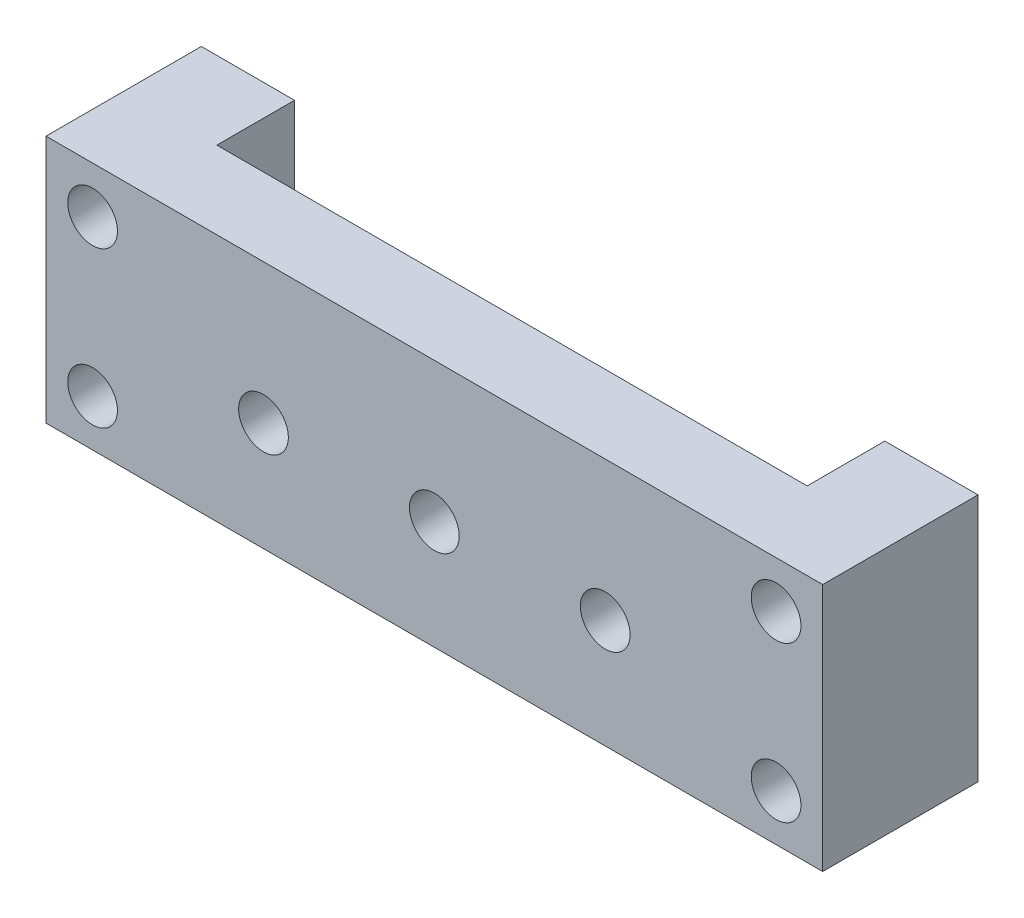
ISO-10303-21;
HEADER;
FILE_DESCRIPTION(('STEP AP214'),'2;1');
FILE_NAME('part.step','',(''),(''),'','','');
FILE_SCHEMA(('AUTOMOTIVE_DESIGN { 1 0 10303 214 1 1 1 1 }'));
ENDSEC;
DATA;
#1=APPLICATION_CONTEXT('core data for automotive mechanical design processes');
#2=APPLICATION_PROTOCOL_DEFINITION('international standard','automotive_design',2000,#1);
#3=PRODUCT_CONTEXT('',#1,'mechanical');
#4=PRODUCT('Part','Part','',(#3));
#5=PRODUCT_RELATED_PRODUCT_CATEGORY('part','',(#4));
#6=PRODUCT_DEFINITION_FORMATION('','',#4);
#7=PRODUCT_DEFINITION_CONTEXT('part definition',#1,'design');
#8=PRODUCT_DEFINITION('design','',#6,#7);
#9=PRODUCT_DEFINITION_SHAPE('','',#8);
#10=(LENGTH_UNIT() NAMED_UNIT(*) SI_UNIT(.MILLI.,.METRE.));
#11=(NAMED_UNIT(*) PLANE_ANGLE_UNIT() SI_UNIT($,.RADIAN.));
#12=(NAMED_UNIT(*) SI_UNIT($,.STERADIAN.) SOLID_ANGLE_UNIT());
#13=UNCERTAINTY_MEASURE_WITH_UNIT(LENGTH_MEASURE(1.E-05),#10,'distance_accuracy_value','');
#14=(GEOMETRIC_REPRESENTATION_CONTEXT(3) GLOBAL_UNCERTAINTY_ASSIGNED_CONTEXT((#13)) GLOBAL_UNIT_ASSIGNED_CONTEXT((#10,
#11,#12)) REPRESENTATION_CONTEXT('',''));
#15=CARTESIAN_POINT('',(0.,0.,0.));
#16=DIRECTION('',(0.,0.,1.));
#17=DIRECTION('',(1.,0.,0.));
#18=AXIS2_PLACEMENT_3D('',#15,#16,#17);
#19=CARTESIAN_POINT('',(0.,0.,0.));
#20=DIRECTION('',(0.,0.,1.));
#21=DIRECTION('',(1.,0.,0.));
#22=AXIS2_PLACEMENT_3D('',#19,#20,#21);
#23=PLANE('',#22);
#24=CARTESIAN_POINT('',(-11.,0.,0.));
#25=DIRECTION('',(0.,0.,1.));
#26=DIRECTION('',(1.,0.,0.));
#27=AXIS2_PLACEMENT_3D('',#24,#25,#26);
#28=CIRCLE('',#27,1.6);
#29=CARTESIAN_POINT('',(-9.4,0.,0.));
#30=VERTEX_POINT('',#29);
#31=EDGE_CURVE('E362',#30,#30,#28,.T.);
#32=ORIENTED_EDGE('',*,*,#31,.T.);
#33=EDGE_LOOP('',(#32));
#34=FACE_BOUND('',#33,.T.);
#35=CARTESIAN_POINT('',(11.,0.,0.));
#36=DIRECTION('',(0.,0.,1.));
#37=DIRECTION('',(1.,0.,0.));
#38=AXIS2_PLACEMENT_3D('',#35,#36,#37);
#39=CIRCLE('',#38,1.6);
#40=CARTESIAN_POINT('',(12.6,0.,0.));
#41=VERTEX_POINT('',#40);
#42=EDGE_CURVE('E363',#41,#41,#39,.T.);
#43=ORIENTED_EDGE('',*,*,#42,.T.);
#44=EDGE_LOOP('',(#43));
#45=FACE_BOUND('',#44,.T.);
#46=CARTESIAN_POINT('',(0.,0.,0.));
#47=DIRECTION('',(0.,0.,1.));
#48=DIRECTION('',(1.,0.,0.));
#49=AXIS2_PLACEMENT_3D('',#46,#47,#48);
#50=CIRCLE('',#49,3.);
#51=CARTESIAN_POINT('',(3.,0.,0.));
#52=VERTEX_POINT('',#51);
#53=EDGE_CURVE('E11',#52,#52,#50,.F.);
#54=ORIENTED_EDGE('',*,*,#53,.F.);
#55=EDGE_LOOP('',(#54));
#56=FACE_BOUND('',#55,.T.);
#57=DIRECTION('',(0.,1.,0.));
#58=VECTOR('',#57,1.);
#59=CARTESIAN_POINT('',(19.,9.,0.));
#60=LINE('',#59,#58);
#61=CARTESIAN_POINT('',(19.,-7.,0.));
#62=VERTEX_POINT('',#61);
#63=CARTESIAN_POINT('',(19.,9.,0.));
#64=VERTEX_POINT('',#63);
#65=EDGE_CURVE('E123',#62,#64,#60,.T.);
#66=ORIENTED_EDGE('',*,*,#65,.F.);
#67=DIRECTION('',(1.,0.,0.));
#68=VECTOR('',#67,1.);
#69=CARTESIAN_POINT('',(-25.,-7.,0.));
#70=LINE('',#69,#68);
#71=CARTESIAN_POINT('',(-19.,-7.,0.));
#72=VERTEX_POINT('',#71);
#73=EDGE_CURVE('E153',#72,#62,#70,.T.);
#74=ORIENTED_EDGE('',*,*,#73,.F.);
#75=DIRECTION('',(0.,-1.,0.));
#76=VECTOR('',#75,1.);
#77=CARTESIAN_POINT('',(-19.,9.,0.));
#78=LINE('',#77,#76);
#79=CARTESIAN_POINT('',(-19.,9.,0.));
#80=VERTEX_POINT('',#79);
#81=EDGE_CURVE('E134',#80,#72,#78,.T.);
#82=ORIENTED_EDGE('',*,*,#81,.F.);
#83=DIRECTION('',(-1.,0.,0.));
#84=VECTOR('',#83,1.);
#85=CARTESIAN_POINT('',(-25.,9.,0.));
#86=LINE('',#85,#84);
#87=EDGE_CURVE('E54',#64,#80,#86,.T.);
#88=ORIENTED_EDGE('',*,*,#87,.F.);
#89=EDGE_LOOP('',(#66,#74,#82,#88));
#90=FACE_BOUND('',#89,.T.);
#91=ADVANCED_FACE('F34',(#34,#45,#56,#90),#23,.F.);
#92=CARTESIAN_POINT('',(-25.,9.,5.));
#93=DIRECTION('',(1.,0.,0.));
#94=DIRECTION('',(0.,0.,-1.));
#95=AXIS2_PLACEMENT_3D('',#92,#93,#94);
#96=PLANE('',#95);
#97=DIRECTION('',(0.,0.,-1.));
#98=VECTOR('',#97,1.);
#99=CARTESIAN_POINT('',(-25.,9.,5.));
#100=LINE('',#99,#98);
#101=CARTESIAN_POINT('',(-25.,9.,5.));
#102=VERTEX_POINT('',#101);
#103=CARTESIAN_POINT('',(-25.,9.,-5.));
#104=VERTEX_POINT('',#103);
#105=EDGE_CURVE('E162',#102,#104,#100,.T.);
#106=ORIENTED_EDGE('',*,*,#105,.T.);
#107=DIRECTION('',(0.,1.,0.));
#108=VECTOR('',#107,1.);
#109=CARTESIAN_POINT('',(-25.,9.,-5.));
#110=LINE('',#109,#108);
#111=CARTESIAN_POINT('',(-25.,-7.,-5.));
#112=VERTEX_POINT('',#111);
#113=EDGE_CURVE('E135',#112,#104,#110,.T.);
#114=ORIENTED_EDGE('',*,*,#113,.F.);
#115=DIRECTION('',(0.,0.,-1.));
#116=VECTOR('',#115,1.);
#117=CARTESIAN_POINT('',(-25.,-7.,5.));
#118=LINE('',#117,#116);
#119=CARTESIAN_POINT('',(-25.,-7.,5.));
#120=VERTEX_POINT('',#119);
#121=EDGE_CURVE('E42',#120,#112,#118,.T.);
#122=ORIENTED_EDGE('',*,*,#121,.F.);
#123=DIRECTION('',(0.,-1.,0.));
#124=VECTOR('',#123,1.);
#125=CARTESIAN_POINT('',(-25.,9.,5.));
#126=LINE('',#125,#124);
#127=EDGE_CURVE('E154',#102,#120,#126,.T.);
#128=ORIENTED_EDGE('',*,*,#127,.F.);
#129=EDGE_LOOP('',(#106,#114,#122,#128));
#130=FACE_BOUND('',#129,.T.);
#131=ADVANCED_FACE('F36',(#130),#96,.F.);
#132=CARTESIAN_POINT('',(-25.,-7.,5.));
#133=DIRECTION('',(0.,1.,0.));
#134=DIRECTION('',(0.,0.,1.));
#135=AXIS2_PLACEMENT_3D('',#132,#133,#134);
#136=PLANE('',#135);
#137=ORIENTED_EDGE('',*,*,#121,.T.);
#138=DIRECTION('',(-1.,0.,0.));
#139=VECTOR('',#138,1.);
#140=CARTESIAN_POINT('',(-25.,-7.,-5.));
#141=LINE('',#140,#139);
#142=CARTESIAN_POINT('',(-19.,-7.,-5.));
#143=VERTEX_POINT('',#142);
#144=EDGE_CURVE('E142',#143,#112,#141,.T.);
#145=ORIENTED_EDGE('',*,*,#144,.F.);
#146=DIRECTION('',(0.,0.,1.));
#147=VECTOR('',#146,1.);
#148=CARTESIAN_POINT('',(-19.,-7.,-5.));
#149=LINE('',#148,#147);
#150=EDGE_CURVE('E145',#143,#72,#149,.T.);
#151=ORIENTED_EDGE('',*,*,#150,.T.);
#152=ORIENTED_EDGE('',*,*,#73,.T.);
#153=DIRECTION('',(0.,0.,1.));
#154=VECTOR('',#153,1.);
#155=CARTESIAN_POINT('',(19.,-7.,-5.));
#156=LINE('',#155,#154);
#157=CARTESIAN_POINT('',(19.,-7.,-5.));
#158=VERTEX_POINT('',#157);
#159=EDGE_CURVE('E115',#158,#62,#156,.T.);
#160=ORIENTED_EDGE('',*,*,#159,.F.);
#161=DIRECTION('',(-1.,0.,0.));
#162=VECTOR('',#161,1.);
#163=CARTESIAN_POINT('',(25.,-7.,-5.));
#164=LINE('',#163,#162);
#165=CARTESIAN_POINT('',(25.,-7.,-5.));
#166=VERTEX_POINT('',#165);
#167=EDGE_CURVE('E112',#166,#158,#164,.T.);
#168=ORIENTED_EDGE('',*,*,#167,.F.);
#169=DIRECTION('',(0.,0.,-1.));
#170=VECTOR('',#169,1.);
#171=CARTESIAN_POINT('',(25.,-7.,5.));
#172=LINE('',#171,#170);
#173=CARTESIAN_POINT('',(25.,-7.,5.));
#174=VERTEX_POINT('',#173);
#175=EDGE_CURVE('E101',#174,#166,#172,.T.);
#176=ORIENTED_EDGE('',*,*,#175,.F.);
#177=DIRECTION('',(1.,0.,0.));
#178=VECTOR('',#177,1.);
#179=CARTESIAN_POINT('',(-25.,-7.,5.));
#180=LINE('',#179,#178);
#181=EDGE_CURVE('E157',#120,#174,#180,.T.);
#182=ORIENTED_EDGE('',*,*,#181,.F.);
#183=EDGE_LOOP('',(#137,#145,#151,#152,#160,#168,#176,#182));
#184=FACE_BOUND('',#183,.T.);
#185=ADVANCED_FACE('F113',(#184),#136,.F.);
#186=CARTESIAN_POINT('',(25.,9.,5.));
#187=DIRECTION('',(-1.,0.,0.));
#188=DIRECTION('',(0.,-1.,0.));
#189=AXIS2_PLACEMENT_3D('',#186,#187,#188);
#190=PLANE('',#189);
#191=ORIENTED_EDGE('',*,*,#175,.T.);
#192=DIRECTION('',(0.,-1.,0.));
#193=VECTOR('',#192,1.);
#194=CARTESIAN_POINT('',(25.,9.,-5.));
#195=LINE('',#194,#193);
#196=CARTESIAN_POINT('',(25.,9.,-5.));
#197=VERTEX_POINT('',#196);
#198=EDGE_CURVE('E106',#197,#166,#195,.T.);
#199=ORIENTED_EDGE('',*,*,#198,.F.);
#200=DIRECTION('',(0.,0.,-1.));
#201=VECTOR('',#200,1.);
#202=CARTESIAN_POINT('',(25.,9.,5.));
#203=LINE('',#202,#201);
#204=CARTESIAN_POINT('',(25.,9.,5.));
#205=VERTEX_POINT('',#204);
#206=EDGE_CURVE('E109',#205,#197,#203,.T.);
#207=ORIENTED_EDGE('',*,*,#206,.F.);
#208=DIRECTION('',(0.,1.,0.));
#209=VECTOR('',#208,1.);
#210=CARTESIAN_POINT('',(25.,9.,5.));
#211=LINE('',#210,#209);
#212=EDGE_CURVE('E107',#174,#205,#211,.T.);
#213=ORIENTED_EDGE('',*,*,#212,.F.);
#214=EDGE_LOOP('',(#191,#199,#207,#213));
#215=FACE_BOUND('',#214,.T.);
#216=ADVANCED_FACE('F103',(#215),#190,.F.);
#217=CARTESIAN_POINT('',(-25.,9.,5.));
#218=DIRECTION('',(0.,-1.,0.));
#219=DIRECTION('',(1.,0.,0.));
#220=AXIS2_PLACEMENT_3D('',#217,#218,#219);
#221=PLANE('',#220);
#222=ORIENTED_EDGE('',*,*,#206,.T.);
#223=DIRECTION('',(1.,0.,0.));
#224=VECTOR('',#223,1.);
#225=CARTESIAN_POINT('',(25.,9.,-5.));
#226=LINE('',#225,#224);
#227=CARTESIAN_POINT('',(19.,9.,-5.));
#228=VERTEX_POINT('',#227);
#229=EDGE_CURVE('E122',#228,#197,#226,.T.);
#230=ORIENTED_EDGE('',*,*,#229,.F.);
#231=DIRECTION('',(0.,0.,1.));
#232=VECTOR('',#231,1.);
#233=CARTESIAN_POINT('',(19.,9.,-5.));
#234=LINE('',#233,#232);
#235=EDGE_CURVE('E49',#228,#64,#234,.T.);
#236=ORIENTED_EDGE('',*,*,#235,.T.);
#237=ORIENTED_EDGE('',*,*,#87,.T.);
#238=DIRECTION('',(0.,0.,1.));
#239=VECTOR('',#238,1.);
#240=CARTESIAN_POINT('',(-19.,9.,-5.));
#241=LINE('',#240,#239);
#242=CARTESIAN_POINT('',(-19.,9.,-5.));
#243=VERTEX_POINT('',#242);
#244=EDGE_CURVE('E150',#243,#80,#241,.T.);
#245=ORIENTED_EDGE('',*,*,#244,.F.);
#246=DIRECTION('',(1.,0.,0.));
#247=VECTOR('',#246,1.);
#248=CARTESIAN_POINT('',(-25.,9.,-5.));
#249=LINE('',#248,#247);
#250=EDGE_CURVE('E138',#104,#243,#249,.T.);
#251=ORIENTED_EDGE('',*,*,#250,.F.);
#252=ORIENTED_EDGE('',*,*,#105,.F.);
#253=DIRECTION('',(-1.,0.,0.));
#254=VECTOR('',#253,1.);
#255=CARTESIAN_POINT('',(-25.,9.,5.));
#256=LINE('',#255,#254);
#257=EDGE_CURVE('E160',#205,#102,#256,.T.);
#258=ORIENTED_EDGE('',*,*,#257,.F.);
#259=EDGE_LOOP('',(#222,#230,#236,#237,#245,#251,#252,#258));
#260=FACE_BOUND('',#259,.T.);
#261=ADVANCED_FACE('F178',(#260),#221,.F.);
#262=CARTESIAN_POINT('',(0.,0.,5.));
#263=DIRECTION('',(0.,0.,1.));
#264=DIRECTION('',(1.,0.,0.));
#265=AXIS2_PLACEMENT_3D('',#262,#263,#264);
#266=PLANE('',#265);
#267=CARTESIAN_POINT('',(-11.,0.,5.));
#268=DIRECTION('',(0.,0.,-1.));
#269=DIRECTION('',(-1.,0.,0.));
#270=AXIS2_PLACEMENT_3D('',#267,#268,#269);
#271=CIRCLE('',#270,1.6);
#272=CARTESIAN_POINT('',(-12.6,0.,5.));
#273=VERTEX_POINT('',#272);
#274=EDGE_CURVE('E360',#273,#273,#271,.T.);
#275=ORIENTED_EDGE('',*,*,#274,.T.);
#276=EDGE_LOOP('',(#275));
#277=FACE_BOUND('',#276,.T.);
#278=CARTESIAN_POINT('',(-22.,-4.,5.));
#279=DIRECTION('',(0.,0.,-1.));
#280=DIRECTION('',(-1.,0.,0.));
#281=AXIS2_PLACEMENT_3D('',#278,#279,#280);
#282=CIRCLE('',#281,1.6);
#283=CARTESIAN_POINT('',(-23.6,-4.,5.));
#284=VERTEX_POINT('',#283);
#285=EDGE_CURVE('E388',#284,#284,#282,.T.);
#286=ORIENTED_EDGE('',*,*,#285,.T.);
#287=EDGE_LOOP('',(#286));
#288=FACE_BOUND('',#287,.T.);
#289=CARTESIAN_POINT('',(-22.,6.,5.));
#290=DIRECTION('',(0.,0.,-1.));
#291=DIRECTION('',(-1.,0.,0.));
#292=AXIS2_PLACEMENT_3D('',#289,#290,#291);
#293=CIRCLE('',#292,1.6);
#294=CARTESIAN_POINT('',(-23.6,6.,5.));
#295=VERTEX_POINT('',#294);
#296=EDGE_CURVE('E382',#295,#295,#293,.T.);
#297=ORIENTED_EDGE('',*,*,#296,.T.);
#298=EDGE_LOOP('',(#297));
#299=FACE_BOUND('',#298,.T.);
#300=CARTESIAN_POINT('',(22.,6.,5.));
#301=DIRECTION('',(0.,0.,-1.));
#302=DIRECTION('',(1.,0.,0.));
#303=AXIS2_PLACEMENT_3D('',#300,#301,#302);
#304=CIRCLE('',#303,1.6);
#305=CARTESIAN_POINT('',(23.6,6.,5.));
#306=VERTEX_POINT('',#305);
#307=EDGE_CURVE('E374',#306,#306,#304,.T.);
#308=ORIENTED_EDGE('',*,*,#307,.T.);
#309=EDGE_LOOP('',(#308));
#310=FACE_BOUND('',#309,.T.);
#311=CARTESIAN_POINT('',(22.,-4.,5.));
#312=DIRECTION('',(0.,0.,-1.));
#313=DIRECTION('',(1.,0.,0.));
#314=AXIS2_PLACEMENT_3D('',#311,#312,#313);
#315=CIRCLE('',#314,1.6);
#316=CARTESIAN_POINT('',(23.6,-4.,5.));
#317=VERTEX_POINT('',#316);
#318=EDGE_CURVE('E381',#317,#317,#315,.T.);
#319=ORIENTED_EDGE('',*,*,#318,.T.);
#320=EDGE_LOOP('',(#319));
#321=FACE_BOUND('',#320,.T.);
#322=CARTESIAN_POINT('',(11.,0.,5.));
#323=DIRECTION('',(0.,0.,-1.));
#324=DIRECTION('',(1.,0.,0.));
#325=AXIS2_PLACEMENT_3D('',#322,#323,#324);
#326=CIRCLE('',#325,1.6);
#327=CARTESIAN_POINT('',(12.6,0.,5.));
#328=VERTEX_POINT('',#327);
#329=EDGE_CURVE('E394',#328,#328,#326,.T.);
#330=ORIENTED_EDGE('',*,*,#329,.T.);
#331=EDGE_LOOP('',(#330));
#332=FACE_BOUND('',#331,.T.);
#333=CARTESIAN_POINT('',(0.,0.,5.));
#334=DIRECTION('',(0.,0.,-1.));
#335=DIRECTION('',(-1.,0.,0.));
#336=AXIS2_PLACEMENT_3D('',#333,#334,#335);
#337=CIRCLE('',#336,1.6);
#338=CARTESIAN_POINT('',(-1.6,0.,5.));
#339=VERTEX_POINT('',#338);
#340=EDGE_CURVE('E366',#339,#339,#337,.T.);
#341=ORIENTED_EDGE('',*,*,#340,.T.);
#342=EDGE_LOOP('',(#341));
#343=FACE_BOUND('',#342,.T.);
#344=ORIENTED_EDGE('',*,*,#127,.T.);
#345=ORIENTED_EDGE('',*,*,#181,.T.);
#346=ORIENTED_EDGE('',*,*,#212,.T.);
#347=ORIENTED_EDGE('',*,*,#257,.T.);
#348=EDGE_LOOP('',(#344,#345,#346,#347));
#349=FACE_BOUND('',#348,.T.);
#350=ADVANCED_FACE('F186',(#277,#288,#299,#310,#321,#332,#343,#349),#266,.T.);
#351=CARTESIAN_POINT('',(-19.,9.,-5.));
#352=DIRECTION('',(-1.,0.,0.));
#353=DIRECTION('',(0.,0.,1.));
#354=AXIS2_PLACEMENT_3D('',#351,#352,#353);
#355=PLANE('',#354);
#356=ORIENTED_EDGE('',*,*,#81,.T.);
#357=ORIENTED_EDGE('',*,*,#150,.F.);
#358=DIRECTION('',(0.,-1.,0.));
#359=VECTOR('',#358,1.);
#360=CARTESIAN_POINT('',(-19.,9.,-5.));
#361=LINE('',#360,#359);
#362=EDGE_CURVE('E140',#243,#143,#361,.T.);
#363=ORIENTED_EDGE('',*,*,#362,.F.);
#364=ORIENTED_EDGE('',*,*,#244,.T.);
#365=EDGE_LOOP('',(#356,#357,#363,#364));
#366=FACE_BOUND('',#365,.T.);
#367=ADVANCED_FACE('F180',(#366),#355,.F.);
#368=CARTESIAN_POINT('',(0.,0.,-5.));
#369=DIRECTION('',(0.,0.,1.));
#370=DIRECTION('',(1.,0.,0.));
#371=AXIS2_PLACEMENT_3D('',#368,#369,#370);
#372=PLANE('',#371);
#373=CARTESIAN_POINT('',(-22.,-4.,-5.));
#374=DIRECTION('',(0.,0.,-1.));
#375=DIRECTION('',(-1.,0.,0.));
#376=AXIS2_PLACEMENT_3D('',#373,#374,#375);
#377=CIRCLE('',#376,1.6);
#378=CARTESIAN_POINT('',(-23.6,-4.,-5.));
#379=VERTEX_POINT('',#378);
#380=EDGE_CURVE('E385',#379,#379,#377,.T.);
#381=ORIENTED_EDGE('',*,*,#380,.F.);
#382=EDGE_LOOP('',(#381));
#383=FACE_BOUND('',#382,.T.);
#384=CARTESIAN_POINT('',(-22.,6.,-5.));
#385=DIRECTION('',(0.,0.,-1.));
#386=DIRECTION('',(-1.,0.,0.));
#387=AXIS2_PLACEMENT_3D('',#384,#385,#386);
#388=CIRCLE('',#387,1.6);
#389=CARTESIAN_POINT('',(-23.6,6.,-5.));
#390=VERTEX_POINT('',#389);
#391=EDGE_CURVE('E377',#390,#390,#388,.T.);
#392=ORIENTED_EDGE('',*,*,#391,.F.);
#393=EDGE_LOOP('',(#392));
#394=FACE_BOUND('',#393,.T.);
#395=ORIENTED_EDGE('',*,*,#113,.T.);
#396=ORIENTED_EDGE('',*,*,#250,.T.);
#397=ORIENTED_EDGE('',*,*,#362,.T.);
#398=ORIENTED_EDGE('',*,*,#144,.T.);
#399=EDGE_LOOP('',(#395,#396,#397,#398));
#400=FACE_BOUND('',#399,.T.);
#401=ADVANCED_FACE('F172',(#383,#394,#400),#372,.F.);
#402=CARTESIAN_POINT('',(19.,9.,-5.));
#403=DIRECTION('',(1.,0.,0.));
#404=DIRECTION('',(0.,0.,-1.));
#405=AXIS2_PLACEMENT_3D('',#402,#403,#404);
#406=PLANE('',#405);
#407=ORIENTED_EDGE('',*,*,#65,.T.);
#408=ORIENTED_EDGE('',*,*,#235,.F.);
#409=DIRECTION('',(0.,1.,0.));
#410=VECTOR('',#409,1.);
#411=CARTESIAN_POINT('',(19.,9.,-5.));
#412=LINE('',#411,#410);
#413=EDGE_CURVE('E118',#158,#228,#412,.T.);
#414=ORIENTED_EDGE('',*,*,#413,.F.);
#415=ORIENTED_EDGE('',*,*,#159,.T.);
#416=EDGE_LOOP('',(#407,#408,#414,#415));
#417=FACE_BOUND('',#416,.T.);
#418=ADVANCED_FACE('F184',(#417),#406,.F.);
#419=CARTESIAN_POINT('',(0.,0.,-5.));
#420=DIRECTION('',(0.,0.,-1.));
#421=DIRECTION('',(-1.,0.,0.));
#422=AXIS2_PLACEMENT_3D('',#419,#420,#421);
#423=PLANE('',#422);
#424=CARTESIAN_POINT('',(22.,6.,-5.));
#425=DIRECTION('',(0.,0.,-1.));
#426=DIRECTION('',(1.,0.,0.));
#427=AXIS2_PLACEMENT_3D('',#424,#425,#426);
#428=CIRCLE('',#427,1.6);
#429=CARTESIAN_POINT('',(23.6,6.,-5.));
#430=VERTEX_POINT('',#429);
#431=EDGE_CURVE('E378',#430,#430,#428,.T.);
#432=ORIENTED_EDGE('',*,*,#431,.F.);
#433=EDGE_LOOP('',(#432));
#434=FACE_BOUND('',#433,.T.);
#435=CARTESIAN_POINT('',(22.,-4.,-5.));
#436=DIRECTION('',(0.,0.,-1.));
#437=DIRECTION('',(1.,0.,0.));
#438=AXIS2_PLACEMENT_3D('',#435,#436,#437);
#439=CIRCLE('',#438,1.6);
#440=CARTESIAN_POINT('',(23.6,-4.,-5.));
#441=VERTEX_POINT('',#440);
#442=EDGE_CURVE('E397',#441,#441,#439,.T.);
#443=ORIENTED_EDGE('',*,*,#442,.F.);
#444=EDGE_LOOP('',(#443));
#445=FACE_BOUND('',#444,.T.);
#446=ORIENTED_EDGE('',*,*,#198,.T.);
#447=ORIENTED_EDGE('',*,*,#167,.T.);
#448=ORIENTED_EDGE('',*,*,#413,.T.);
#449=ORIENTED_EDGE('',*,*,#229,.T.);
#450=EDGE_LOOP('',(#446,#447,#448,#449));
#451=FACE_BOUND('',#450,.T.);
#452=ADVANCED_FACE('F121',(#434,#445,#451),#423,.T.);
#453=CARTESIAN_POINT('',(0.,0.,-5.));
#454=DIRECTION('',(0.,0.,1.));
#455=DIRECTION('',(1.,0.,0.));
#456=AXIS2_PLACEMENT_3D('',#453,#454,#455);
#457=CYLINDRICAL_SURFACE('',#456,3.);
#458=CARTESIAN_POINT('',(0.,0.,-5.));
#459=DIRECTION('',(0.,0.,-1.));
#460=DIRECTION('',(-1.,0.,0.));
#461=AXIS2_PLACEMENT_3D('',#458,#459,#460);
#462=CIRCLE('',#461,3.);
#463=CARTESIAN_POINT('',(-3.,0.,-5.));
#464=VERTEX_POINT('',#463);
#465=EDGE_CURVE('E125',#464,#464,#462,.T.);
#466=ORIENTED_EDGE('',*,*,#465,.F.);
#467=EDGE_LOOP('',(#466));
#468=FACE_BOUND('',#467,.T.);
#469=ORIENTED_EDGE('',*,*,#53,.T.);
#470=EDGE_LOOP('',(#469));
#471=FACE_BOUND('',#470,.T.);
#472=ADVANCED_FACE('F245',(#468,#471),#457,.T.);
#473=CARTESIAN_POINT('',(0.,0.,-5.));
#474=DIRECTION('',(0.,0.,-1.));
#475=DIRECTION('',(-1.,0.,0.));
#476=AXIS2_PLACEMENT_3D('',#473,#474,#475);
#477=PLANE('',#476);
#478=CARTESIAN_POINT('',(0.,0.,-5.));
#479=DIRECTION('',(0.,0.,-1.));
#480=DIRECTION('',(-1.,0.,0.));
#481=AXIS2_PLACEMENT_3D('',#478,#479,#480);
#482=CIRCLE('',#481,1.6);
#483=CARTESIAN_POINT('',(-1.6,0.,-5.));
#484=VERTEX_POINT('',#483);
#485=EDGE_CURVE('E371',#484,#484,#482,.T.);
#486=ORIENTED_EDGE('',*,*,#485,.F.);
#487=EDGE_LOOP('',(#486));
#488=FACE_BOUND('',#487,.T.);
#489=ORIENTED_EDGE('',*,*,#465,.T.);
#490=EDGE_LOOP('',(#489));
#491=FACE_BOUND('',#490,.T.);
#492=ADVANCED_FACE('F249',(#488,#491),#477,.T.);
#493=CARTESIAN_POINT('',(0.,0.,5.));
#494=DIRECTION('',(0.,0.,-1.));
#495=DIRECTION('',(-1.,0.,0.));
#496=AXIS2_PLACEMENT_3D('',#493,#494,#495);
#497=CYLINDRICAL_SURFACE('',#496,1.6);
#498=ORIENTED_EDGE('',*,*,#340,.F.);
#499=EDGE_LOOP('',(#498));
#500=FACE_BOUND('',#499,.T.);
#501=ORIENTED_EDGE('',*,*,#485,.T.);
#502=EDGE_LOOP('',(#501));
#503=FACE_BOUND('',#502,.T.);
#504=ADVANCED_FACE('F284',(#500,#503),#497,.F.);
#505=CARTESIAN_POINT('',(22.,-4.,5.));
#506=DIRECTION('',(0.,0.,-1.));
#507=DIRECTION('',(-1.,0.,0.));
#508=AXIS2_PLACEMENT_3D('',#505,#506,#507);
#509=CYLINDRICAL_SURFACE('',#508,1.6);
#510=ORIENTED_EDGE('',*,*,#318,.F.);
#511=EDGE_LOOP('',(#510));
#512=FACE_BOUND('',#511,.T.);
#513=ORIENTED_EDGE('',*,*,#442,.T.);
#514=EDGE_LOOP('',(#513));
#515=FACE_BOUND('',#514,.T.);
#516=ADVANCED_FACE('F294',(#512,#515),#509,.F.);
#517=CARTESIAN_POINT('',(22.,6.,5.));
#518=DIRECTION('',(0.,0.,-1.));
#519=DIRECTION('',(-1.,0.,0.));
#520=AXIS2_PLACEMENT_3D('',#517,#518,#519);
#521=CYLINDRICAL_SURFACE('',#520,1.6);
#522=ORIENTED_EDGE('',*,*,#307,.F.);
#523=EDGE_LOOP('',(#522));
#524=FACE_BOUND('',#523,.T.);
#525=ORIENTED_EDGE('',*,*,#431,.T.);
#526=EDGE_LOOP('',(#525));
#527=FACE_BOUND('',#526,.T.);
#528=ADVANCED_FACE('F304',(#524,#527),#521,.F.);
#529=CARTESIAN_POINT('',(-22.,6.,5.));
#530=DIRECTION('',(0.,0.,-1.));
#531=DIRECTION('',(-1.,0.,0.));
#532=AXIS2_PLACEMENT_3D('',#529,#530,#531);
#533=CYLINDRICAL_SURFACE('',#532,1.6);
#534=ORIENTED_EDGE('',*,*,#296,.F.);
#535=EDGE_LOOP('',(#534));
#536=FACE_BOUND('',#535,.T.);
#537=ORIENTED_EDGE('',*,*,#391,.T.);
#538=EDGE_LOOP('',(#537));
#539=FACE_BOUND('',#538,.T.);
#540=ADVANCED_FACE('F314',(#536,#539),#533,.F.);
#541=CARTESIAN_POINT('',(-22.,-4.,5.));
#542=DIRECTION('',(0.,0.,-1.));
#543=DIRECTION('',(-1.,0.,0.));
#544=AXIS2_PLACEMENT_3D('',#541,#542,#543);
#545=CYLINDRICAL_SURFACE('',#544,1.6);
#546=ORIENTED_EDGE('',*,*,#285,.F.);
#547=EDGE_LOOP('',(#546));
#548=FACE_BOUND('',#547,.T.);
#549=ORIENTED_EDGE('',*,*,#380,.T.);
#550=EDGE_LOOP('',(#549));
#551=FACE_BOUND('',#550,.T.);
#552=ADVANCED_FACE('F324',(#548,#551),#545,.F.);
#553=CARTESIAN_POINT('',(11.,0.,5.));
#554=DIRECTION('',(0.,0.,-1.));
#555=DIRECTION('',(-1.,0.,0.));
#556=AXIS2_PLACEMENT_3D('',#553,#554,#555);
#557=CYLINDRICAL_SURFACE('',#556,1.6);
#558=ORIENTED_EDGE('',*,*,#329,.F.);
#559=EDGE_LOOP('',(#558));
#560=FACE_BOUND('',#559,.T.);
#561=ORIENTED_EDGE('',*,*,#42,.F.);
#562=EDGE_LOOP('',(#561));
#563=FACE_BOUND('',#562,.T.);
#564=ADVANCED_FACE('F334',(#560,#563),#557,.F.);
#565=CARTESIAN_POINT('',(-11.,0.,5.));
#566=DIRECTION('',(0.,0.,-1.));
#567=DIRECTION('',(-1.,0.,0.));
#568=AXIS2_PLACEMENT_3D('',#565,#566,#567);
#569=CYLINDRICAL_SURFACE('',#568,1.6);
#570=ORIENTED_EDGE('',*,*,#274,.F.);
#571=EDGE_LOOP('',(#570));
#572=FACE_BOUND('',#571,.T.);
#573=ORIENTED_EDGE('',*,*,#31,.F.);
#574=EDGE_LOOP('',(#573));
#575=FACE_BOUND('',#574,.T.);
#576=ADVANCED_FACE('F344',(#572,#575),#569,.F.);
#577=CLOSED_SHELL('',(#91,#131,#185,#216,#261,#350,#367,#401,#418,#452,#472,#492,#504,#516,#528,
#540,#552,#564,#576));
#578=MANIFOLD_SOLID_BREP('B2',#577);
#579=ADVANCED_BREP_SHAPE_REPRESENTATION('',(#18,#578),#14);
#580=SHAPE_DEFINITION_REPRESENTATION(#9,#579);
ENDSEC;
END-ISO-10303-21;
